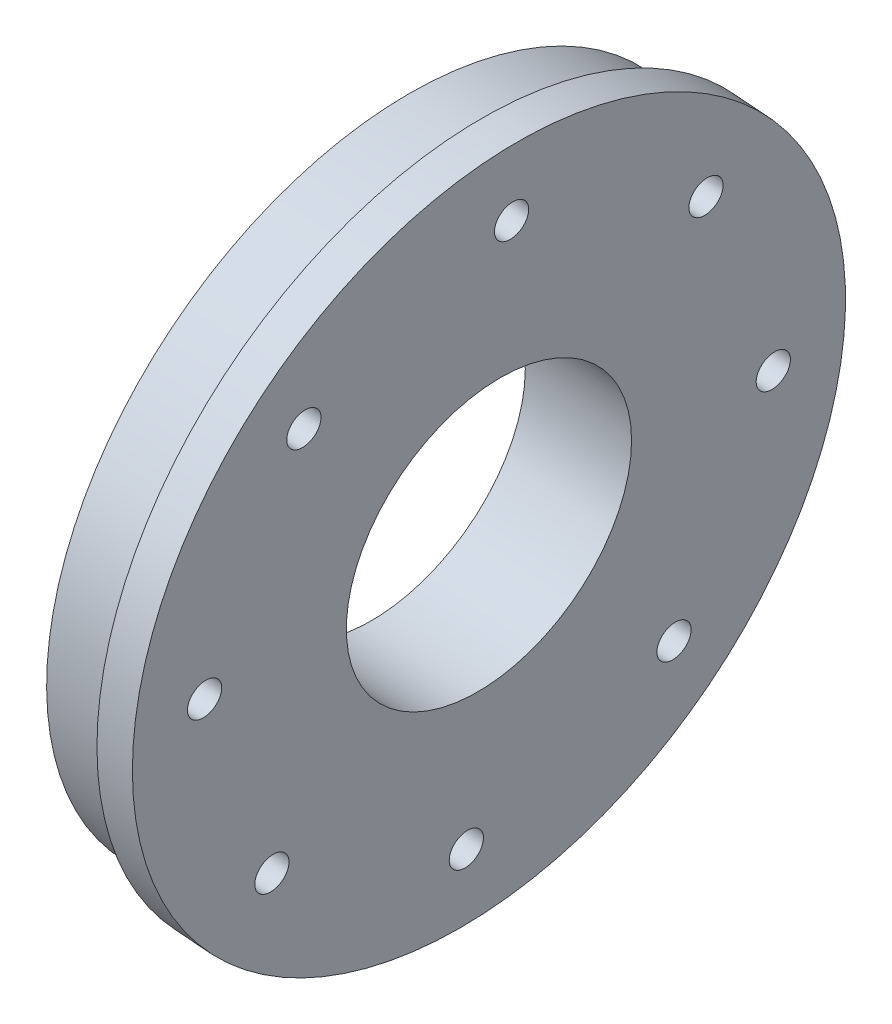
ISO-10303-21;
HEADER;
FILE_DESCRIPTION(('STEP AP214'),'2;1');
FILE_NAME('part.step','',(''),(''),'','','');
FILE_SCHEMA(('AUTOMOTIVE_DESIGN { 1 0 10303 214 1 1 1 1 }'));
ENDSEC;
DATA;
#1=APPLICATION_CONTEXT('core data for automotive mechanical design processes');
#2=APPLICATION_PROTOCOL_DEFINITION('international standard','automotive_design',2000,#1);
#3=PRODUCT_CONTEXT('',#1,'mechanical');
#4=PRODUCT('Part','Part','',(#3));
#5=PRODUCT_RELATED_PRODUCT_CATEGORY('part','',(#4));
#6=PRODUCT_DEFINITION_FORMATION('','',#4);
#7=PRODUCT_DEFINITION_CONTEXT('part definition',#1,'design');
#8=PRODUCT_DEFINITION('design','',#6,#7);
#9=PRODUCT_DEFINITION_SHAPE('','',#8);
#10=(LENGTH_UNIT() NAMED_UNIT(*) SI_UNIT(.MILLI.,.METRE.));
#11=(NAMED_UNIT(*) PLANE_ANGLE_UNIT() SI_UNIT($,.RADIAN.));
#12=(NAMED_UNIT(*) SI_UNIT($,.STERADIAN.) SOLID_ANGLE_UNIT());
#13=UNCERTAINTY_MEASURE_WITH_UNIT(LENGTH_MEASURE(1.E-05),#10,'distance_accuracy_value','');
#14=(GEOMETRIC_REPRESENTATION_CONTEXT(3) GLOBAL_UNCERTAINTY_ASSIGNED_CONTEXT((#13)) GLOBAL_UNIT_ASSIGNED_CONTEXT((#10,
#11,#12)) REPRESENTATION_CONTEXT('',''));
#15=CARTESIAN_POINT('',(0.,0.,0.));
#16=DIRECTION('',(0.,0.,1.));
#17=DIRECTION('',(1.,0.,0.));
#18=AXIS2_PLACEMENT_3D('',#15,#16,#17);
#19=CARTESIAN_POINT('',(230.211383275251,-9.78704603325022,43.174261814343));
#20=DIRECTION('',(0.996833274877087,-0.0795199477981641,0.));
#21=DIRECTION('',(0.0795199477981641,0.996833274877087,0.));
#22=AXIS2_PLACEMENT_3D('',#19,#20,#21);
#23=CYLINDRICAL_SURFACE('',#22,14.9606);
#24=CARTESIAN_POINT('',(233.376328922986,-10.0395218675094,43.174261814343));
#25=DIRECTION('',(-0.996833274877087,0.0795199477981641,0.));
#26=DIRECTION('',(-0.0795199477981641,-0.996833274877087,0.));
#27=AXIS2_PLACEMENT_3D('',#24,#25,#26);
#28=CIRCLE('',#27,14.9606);
#29=CARTESIAN_POINT('',(232.186662791956,-24.9527457596355,43.174261814343));
#30=VERTEX_POINT('',#29);
#31=EDGE_CURVE('E10',#30,#30,#28,.F.);
#32=ORIENTED_EDGE('',*,*,#31,.F.);
#33=EDGE_LOOP('',(#32));
#34=FACE_BOUND('',#33,.T.);
#35=CARTESIAN_POINT('',(230.211383275251,-9.78704603325022,43.174261814343));
#36=DIRECTION('',(0.996833274877087,-0.0795199477981641,0.));
#37=DIRECTION('',(0.0795199477981641,0.996833274877087,0.));
#38=AXIS2_PLACEMENT_3D('',#35,#36,#37);
#39=CIRCLE('',#38,14.9606);
#40=CARTESIAN_POINT('',(231.40104940628,5.12617785887592,43.174261814343));
#41=VERTEX_POINT('',#40);
#42=EDGE_CURVE('E37',#41,#41,#39,.T.);
#43=ORIENTED_EDGE('',*,*,#42,.T.);
#44=EDGE_LOOP('',(#43));
#45=FACE_BOUND('',#44,.T.);
#46=ADVANCED_FACE('F31',(#34,#45),#23,.T.);
#47=CARTESIAN_POINT('',(230.211383275251,-9.78704603325022,43.174261814343));
#48=DIRECTION('',(0.996833274877087,-0.0795199477981641,0.));
#49=DIRECTION('',(0.0795199477981641,0.996833274877087,0.));
#50=AXIS2_PLACEMENT_3D('',#47,#48,#49);
#51=PLANE('',#50);
#52=CARTESIAN_POINT('',(230.211383275251,-9.78704603325057,30.4742618143433));
#53=DIRECTION('',(-0.996833274877087,0.0795199477981641,0.));
#54=DIRECTION('',(-0.0795199477981641,-0.996833274877087,0.));
#55=AXIS2_PLACEMENT_3D('',#52,#53,#54);
#56=CIRCLE('',#55,0.761999999999999);
#57=CARTESIAN_POINT('',(230.150789075029,-10.5466329887069,30.4742618143433));
#58=VERTEX_POINT('',#57);
#59=EDGE_CURVE('E54',#58,#58,#56,.T.);
#60=ORIENTED_EDGE('',*,*,#59,.F.);
#61=EDGE_LOOP('',(#60));
#62=FACE_BOUND('',#61,.T.);
#63=CARTESIAN_POINT('',(230.925492773212,-0.835227914850099,34.1940056932739));
#64=DIRECTION('',(-0.996833274877087,0.0795199477981641,0.));
#65=DIRECTION('',(-0.0795199477981641,-0.996833274877087,0.));
#66=AXIS2_PLACEMENT_3D('',#63,#64,#65);
#67=CIRCLE('',#66,0.761999999999996);
#68=CARTESIAN_POINT('',(230.86489857299,-1.59481487030644,34.1940056932739));
#69=VERTEX_POINT('',#68);
#70=EDGE_CURVE('E92',#69,#69,#67,.T.);
#71=ORIENTED_EDGE('',*,*,#70,.F.);
#72=EDGE_LOOP('',(#71));
#73=FACE_BOUND('',#72,.T.);
#74=CARTESIAN_POINT('',(229.497273777289,-18.7388641516508,34.1940056932744));
#75=DIRECTION('',(-0.996833274877087,0.0795199477981641,0.));
#76=DIRECTION('',(-0.0795199477981641,-0.996833274877087,0.));
#77=AXIS2_PLACEMENT_3D('',#74,#75,#76);
#78=CIRCLE('',#77,0.761999999999996);
#79=CARTESIAN_POINT('',(229.436679577067,-19.4984511071072,34.1940056932744));
#80=VERTEX_POINT('',#79);
#81=EDGE_CURVE('E95',#80,#80,#78,.T.);
#82=ORIENTED_EDGE('',*,*,#81,.F.);
#83=EDGE_LOOP('',(#82));
#84=FACE_BOUND('',#83,.T.);
#85=CARTESIAN_POINT('',(229.201479938214,-22.4468286241892,43.1742618143437));
#86=DIRECTION('',(-0.996833274877087,0.0795199477981641,0.));
#87=DIRECTION('',(-0.0795199477981641,-0.996833274877087,0.));
#88=AXIS2_PLACEMENT_3D('',#85,#86,#87);
#89=CIRCLE('',#88,0.761999999999996);
#90=CARTESIAN_POINT('',(229.140885737992,-23.2064155796456,43.1742618143437));
#91=VERTEX_POINT('',#90);
#92=EDGE_CURVE('E83',#91,#91,#89,.T.);
#93=ORIENTED_EDGE('',*,*,#92,.F.);
#94=EDGE_LOOP('',(#93));
#95=FACE_BOUND('',#94,.T.);
#96=CARTESIAN_POINT('',(229.497273777289,-18.7388641516504,52.1545179354127));
#97=DIRECTION('',(-0.996833274877087,0.0795199477981641,0.));
#98=DIRECTION('',(-0.0795199477981641,-0.996833274877087,0.));
#99=AXIS2_PLACEMENT_3D('',#96,#97,#98);
#100=CIRCLE('',#99,0.761999999999996);
#101=CARTESIAN_POINT('',(229.436679577067,-19.4984511071067,52.1545179354127));
#102=VERTEX_POINT('',#101);
#103=EDGE_CURVE('E79',#102,#102,#100,.T.);
#104=ORIENTED_EDGE('',*,*,#103,.F.);
#105=EDGE_LOOP('',(#104));
#106=FACE_BOUND('',#105,.T.);
#107=CARTESIAN_POINT('',(230.211383275251,-9.78704603324989,55.8742618143433));
#108=DIRECTION('',(-0.996833274877087,0.0795199477981641,0.));
#109=DIRECTION('',(-0.0795199477981641,-0.996833274877087,0.));
#110=AXIS2_PLACEMENT_3D('',#107,#108,#109);
#111=CIRCLE('',#110,0.761999999999996);
#112=CARTESIAN_POINT('',(230.150789075029,-10.5466329887062,55.8742618143433));
#113=VERTEX_POINT('',#112);
#114=EDGE_CURVE('E82',#113,#113,#111,.T.);
#115=ORIENTED_EDGE('',*,*,#114,.F.);
#116=EDGE_LOOP('',(#115));
#117=FACE_BOUND('',#116,.T.);
#118=CARTESIAN_POINT('',(230.925492773213,-0.835227914849617,52.1545179354122));
#119=DIRECTION('',(-0.996833274877087,0.0795199477981641,0.));
#120=DIRECTION('',(-0.0795199477981641,-0.996833274877087,0.));
#121=AXIS2_PLACEMENT_3D('',#118,#119,#120);
#122=CIRCLE('',#121,0.761999999999996);
#123=CARTESIAN_POINT('',(230.86489857299,-1.59481487030595,52.1545179354122));
#124=VERTEX_POINT('',#123);
#125=EDGE_CURVE('E86',#124,#124,#122,.T.);
#126=ORIENTED_EDGE('',*,*,#125,.F.);
#127=EDGE_LOOP('',(#126));
#128=FACE_BOUND('',#127,.T.);
#129=CARTESIAN_POINT('',(231.221286612288,2.87273655768877,43.174261814343));
#130=DIRECTION('',(-0.996833274877087,0.0795199477981641,0.));
#131=DIRECTION('',(-0.0795199477981641,-0.996833274877087,0.));
#132=AXIS2_PLACEMENT_3D('',#129,#130,#131);
#133=CIRCLE('',#132,0.761999999999996);
#134=CARTESIAN_POINT('',(231.160692412065,2.11314960223244,43.174261814343));
#135=VERTEX_POINT('',#134);
#136=EDGE_CURVE('E89',#135,#135,#133,.T.);
#137=ORIENTED_EDGE('',*,*,#136,.F.);
#138=EDGE_LOOP('',(#137));
#139=FACE_BOUND('',#138,.T.);
#140=CARTESIAN_POINT('',(230.211383275251,-9.78704603325022,43.174261814343));
#141=DIRECTION('',(0.996833274877087,-0.0795199477981641,0.));
#142=DIRECTION('',(0.0795199477981641,0.996833274877087,0.));
#143=AXIS2_PLACEMENT_3D('',#140,#141,#142);
#144=CIRCLE('',#143,6.35);
#145=CARTESIAN_POINT('',(230.716334943769,-3.45715473778072,43.174261814343));
#146=VERTEX_POINT('',#145);
#147=EDGE_CURVE('E41',#146,#146,#144,.T.);
#148=ORIENTED_EDGE('',*,*,#147,.T.);
#149=EDGE_LOOP('',(#148));
#150=FACE_BOUND('',#149,.T.);
#151=ORIENTED_EDGE('',*,*,#42,.F.);
#152=EDGE_LOOP('',(#151));
#153=FACE_BOUND('',#152,.T.);
#154=ADVANCED_FACE('F120',(#62,#73,#84,#95,#106,#117,#128,#139,#150,#153),#51,.F.);
#155=CARTESIAN_POINT('',(234.958801746853,-10.165759784639,43.174261814343));
#156=DIRECTION('',(0.996833274877087,-0.0795199477981641,0.));
#157=DIRECTION('',(0.0795199477981641,0.996833274877087,0.));
#158=AXIS2_PLACEMENT_3D('',#155,#156,#157);
#159=PLANE('',#158);
#160=CARTESIAN_POINT('',(234.958801746853,-10.1657597846393,30.4742618143433));
#161=DIRECTION('',(0.996833274877087,-0.0795199477981641,0.));
#162=DIRECTION('',(0.0795199477981641,0.996833274877087,0.));
#163=AXIS2_PLACEMENT_3D('',#160,#161,#162);
#164=CIRCLE('',#163,0.761999999999999);
#165=CARTESIAN_POINT('',(235.019395947075,-9.40617282918298,30.4742618143433));
#166=VERTEX_POINT('',#165);
#167=EDGE_CURVE('E71',#166,#166,#164,.T.);
#168=ORIENTED_EDGE('',*,*,#167,.F.);
#169=EDGE_LOOP('',(#168));
#170=FACE_BOUND('',#169,.T.);
#171=CARTESIAN_POINT('',(235.672911244815,-1.21394166623885,34.1940056932739));
#172=DIRECTION('',(0.996833274877087,-0.0795199477981641,0.));
#173=DIRECTION('',(0.0795199477981641,0.996833274877087,0.));
#174=AXIS2_PLACEMENT_3D('',#171,#172,#173);
#175=CIRCLE('',#174,0.761999999999996);
#176=CARTESIAN_POINT('',(235.733505445037,-0.454354710782518,34.1940056932739));
#177=VERTEX_POINT('',#176);
#178=EDGE_CURVE('E69',#177,#177,#175,.T.);
#179=ORIENTED_EDGE('',*,*,#178,.F.);
#180=EDGE_LOOP('',(#179));
#181=FACE_BOUND('',#180,.T.);
#182=CARTESIAN_POINT('',(234.244692248891,-19.1175779030396,34.1940056932744));
#183=DIRECTION('',(0.996833274877087,-0.0795199477981641,0.));
#184=DIRECTION('',(0.0795199477981641,0.996833274877087,0.));
#185=AXIS2_PLACEMENT_3D('',#182,#183,#184);
#186=CIRCLE('',#185,0.761999999999996);
#187=CARTESIAN_POINT('',(234.305286449114,-18.3579909475832,34.1940056932744));
#188=VERTEX_POINT('',#187);
#189=EDGE_CURVE('E66',#188,#188,#186,.T.);
#190=ORIENTED_EDGE('',*,*,#189,.F.);
#191=EDGE_LOOP('',(#190));
#192=FACE_BOUND('',#191,.T.);
#193=CARTESIAN_POINT('',(233.948898409816,-22.825542375578,43.1742618143437));
#194=DIRECTION('',(0.996833274877087,-0.0795199477981641,0.));
#195=DIRECTION('',(0.0795199477981641,0.996833274877087,0.));
#196=AXIS2_PLACEMENT_3D('',#193,#194,#195);
#197=CIRCLE('',#196,0.761999999999996);
#198=CARTESIAN_POINT('',(234.009492610039,-22.0659554201216,43.1742618143437));
#199=VERTEX_POINT('',#198);
#200=EDGE_CURVE('E63',#199,#199,#197,.T.);
#201=ORIENTED_EDGE('',*,*,#200,.F.);
#202=EDGE_LOOP('',(#201));
#203=FACE_BOUND('',#202,.T.);
#204=CARTESIAN_POINT('',(234.244692248891,-19.1175779030391,52.1545179354127));
#205=DIRECTION('',(0.996833274877087,-0.0795199477981641,0.));
#206=DIRECTION('',(0.0795199477981641,0.996833274877087,0.));
#207=AXIS2_PLACEMENT_3D('',#204,#205,#206);
#208=CIRCLE('',#207,0.761999999999996);
#209=CARTESIAN_POINT('',(234.305286449114,-18.3579909475828,52.1545179354127));
#210=VERTEX_POINT('',#209);
#211=EDGE_CURVE('E60',#210,#210,#208,.T.);
#212=ORIENTED_EDGE('',*,*,#211,.F.);
#213=EDGE_LOOP('',(#212));
#214=FACE_BOUND('',#213,.T.);
#215=CARTESIAN_POINT('',(234.958801746853,-10.1657597846386,55.8742618143433));
#216=DIRECTION('',(0.996833274877087,-0.0795199477981641,0.));
#217=DIRECTION('',(0.0795199477981641,0.996833274877087,0.));
#218=AXIS2_PLACEMENT_3D('',#215,#216,#217);
#219=CIRCLE('',#218,0.761999999999996);
#220=CARTESIAN_POINT('',(235.019395947075,-9.4061728291823,55.8742618143433));
#221=VERTEX_POINT('',#220);
#222=EDGE_CURVE('E57',#221,#221,#219,.T.);
#223=ORIENTED_EDGE('',*,*,#222,.F.);
#224=EDGE_LOOP('',(#223));
#225=FACE_BOUND('',#224,.T.);
#226=CARTESIAN_POINT('',(235.672911244815,-1.21394166623837,52.1545179354122));
#227=DIRECTION('',(0.996833274877087,-0.0795199477981641,0.));
#228=DIRECTION('',(0.0795199477981641,0.996833274877087,0.));
#229=AXIS2_PLACEMENT_3D('',#226,#227,#228);
#230=CIRCLE('',#229,0.761999999999996);
#231=CARTESIAN_POINT('',(235.733505445037,-0.454354710782031,52.1545179354122));
#232=VERTEX_POINT('',#231);
#233=EDGE_CURVE('E53',#232,#232,#230,.T.);
#234=ORIENTED_EDGE('',*,*,#233,.F.);
#235=EDGE_LOOP('',(#234));
#236=FACE_BOUND('',#235,.T.);
#237=CARTESIAN_POINT('',(235.96870508389,2.49402280630003,43.174261814343));
#238=DIRECTION('',(0.996833274877087,-0.0795199477981641,0.));
#239=DIRECTION('',(0.0795199477981641,0.996833274877087,0.));
#240=AXIS2_PLACEMENT_3D('',#237,#238,#239);
#241=CIRCLE('',#240,0.761999999999996);
#242=CARTESIAN_POINT('',(236.029299284112,3.25360976175636,43.174261814343));
#243=VERTEX_POINT('',#242);
#244=EDGE_CURVE('E50',#243,#243,#241,.T.);
#245=ORIENTED_EDGE('',*,*,#244,.F.);
#246=EDGE_LOOP('',(#245));
#247=FACE_BOUND('',#246,.T.);
#248=CARTESIAN_POINT('',(234.958801746853,-10.165759784639,43.174261814343));
#249=DIRECTION('',(0.996833274877087,-0.0795199477981641,0.));
#250=DIRECTION('',(0.0795199477981641,0.996833274877087,0.));
#251=AXIS2_PLACEMENT_3D('',#248,#249,#250);
#252=CIRCLE('',#251,6.35);
#253=CARTESIAN_POINT('',(235.463753415371,-3.83586848916948,43.174261814343));
#254=VERTEX_POINT('',#253);
#255=EDGE_CURVE('E46',#254,#254,#252,.T.);
#256=ORIENTED_EDGE('',*,*,#255,.F.);
#257=EDGE_LOOP('',(#256));
#258=FACE_BOUND('',#257,.T.);
#259=CARTESIAN_POINT('',(234.958801746853,-10.165759784639,43.174261814343));
#260=DIRECTION('',(-0.996833274877087,0.0795199477981641,0.));
#261=DIRECTION('',(-0.0795199477981641,-0.996833274877087,0.));
#262=AXIS2_PLACEMENT_3D('',#259,#260,#261);
#263=CIRCLE('',#262,15.875);
#264=CARTESIAN_POINT('',(233.696422575557,-25.9904880233127,43.174261814343));
#265=VERTEX_POINT('',#264);
#266=EDGE_CURVE('E103',#265,#265,#263,.T.);
#267=ORIENTED_EDGE('',*,*,#266,.F.);
#268=EDGE_LOOP('',(#267));
#269=FACE_BOUND('',#268,.T.);
#270=ADVANCED_FACE('F117',(#170,#181,#192,#203,#214,#225,#236,#247,#258,#269),#159,.T.);
#271=CARTESIAN_POINT('',(228.628910451384,-9.66080811612064,43.174261814343));
#272=DIRECTION('',(0.996833274877087,-0.0795199477981641,0.));
#273=DIRECTION('',(0.0795199477981641,0.996833274877087,0.));
#274=AXIS2_PLACEMENT_3D('',#271,#272,#273);
#275=CYLINDRICAL_SURFACE('',#274,6.35);
#276=ORIENTED_EDGE('',*,*,#255,.T.);
#277=EDGE_LOOP('',(#276));
#278=FACE_BOUND('',#277,.T.);
#279=ORIENTED_EDGE('',*,*,#147,.F.);
#280=EDGE_LOOP('',(#279));
#281=FACE_BOUND('',#280,.T.);
#282=ADVANCED_FACE('F119',(#278,#281),#275,.F.);
#283=CARTESIAN_POINT('',(241.189619361059,2.07753707970713,43.174261814343));
#284=DIRECTION('',(-0.996833274877087,0.0795199477981641,0.));
#285=DIRECTION('',(-0.0795199477981641,-0.996833274877087,0.));
#286=AXIS2_PLACEMENT_3D('',#283,#284,#285);
#287=CYLINDRICAL_SURFACE('',#286,0.761999999999996);
#288=ORIENTED_EDGE('',*,*,#244,.T.);
#289=EDGE_LOOP('',(#288));
#290=FACE_BOUND('',#289,.T.);
#291=ORIENTED_EDGE('',*,*,#136,.T.);
#292=EDGE_LOOP('',(#291));
#293=FACE_BOUND('',#292,.T.);
#294=ADVANCED_FACE('F126',(#290,#293),#287,.F.);
#295=CARTESIAN_POINT('',(240.893825521983,-1.63042739283126,52.1545179354122));
#296=DIRECTION('',(-0.996833274877087,0.0795199477981641,0.));
#297=DIRECTION('',(-0.0795199477981641,-0.996833274877087,0.));
#298=AXIS2_PLACEMENT_3D('',#295,#296,#297);
#299=CYLINDRICAL_SURFACE('',#298,0.761999999999996);
#300=ORIENTED_EDGE('',*,*,#233,.T.);
#301=EDGE_LOOP('',(#300));
#302=FACE_BOUND('',#301,.T.);
#303=ORIENTED_EDGE('',*,*,#125,.T.);
#304=EDGE_LOOP('',(#303));
#305=FACE_BOUND('',#304,.T.);
#306=ADVANCED_FACE('F153',(#302,#305),#299,.F.);
#307=CARTESIAN_POINT('',(240.179716024022,-10.5822455112315,55.8742618143433));
#308=DIRECTION('',(-0.996833274877087,0.0795199477981641,0.));
#309=DIRECTION('',(-0.0795199477981641,-0.996833274877087,0.));
#310=AXIS2_PLACEMENT_3D('',#307,#308,#309);
#311=CYLINDRICAL_SURFACE('',#310,0.761999999999996);
#312=ORIENTED_EDGE('',*,*,#222,.T.);
#313=EDGE_LOOP('',(#312));
#314=FACE_BOUND('',#313,.T.);
#315=ORIENTED_EDGE('',*,*,#114,.T.);
#316=EDGE_LOOP('',(#315));
#317=FACE_BOUND('',#316,.T.);
#318=ADVANCED_FACE('F163',(#314,#317),#311,.F.);
#319=CARTESIAN_POINT('',(239.46560652606,-19.534063629632,52.1545179354127));
#320=DIRECTION('',(-0.996833274877087,0.0795199477981641,0.));
#321=DIRECTION('',(-0.0795199477981641,-0.996833274877087,0.));
#322=AXIS2_PLACEMENT_3D('',#319,#320,#321);
#323=CYLINDRICAL_SURFACE('',#322,0.761999999999996);
#324=ORIENTED_EDGE('',*,*,#211,.T.);
#325=EDGE_LOOP('',(#324));
#326=FACE_BOUND('',#325,.T.);
#327=ORIENTED_EDGE('',*,*,#103,.T.);
#328=EDGE_LOOP('',(#327));
#329=FACE_BOUND('',#328,.T.);
#330=ADVANCED_FACE('F173',(#326,#329),#323,.F.);
#331=CARTESIAN_POINT('',(239.169812686985,-23.2420281021709,43.1742618143437));
#332=DIRECTION('',(-0.996833274877087,0.0795199477981641,0.));
#333=DIRECTION('',(-0.0795199477981641,-0.996833274877087,0.));
#334=AXIS2_PLACEMENT_3D('',#331,#332,#333);
#335=CYLINDRICAL_SURFACE('',#334,0.761999999999996);
#336=ORIENTED_EDGE('',*,*,#200,.T.);
#337=EDGE_LOOP('',(#336));
#338=FACE_BOUND('',#337,.T.);
#339=ORIENTED_EDGE('',*,*,#92,.T.);
#340=EDGE_LOOP('',(#339));
#341=FACE_BOUND('',#340,.T.);
#342=ADVANCED_FACE('F183',(#338,#341),#335,.F.);
#343=CARTESIAN_POINT('',(239.46560652606,-19.5340636296325,34.1940056932744));
#344=DIRECTION('',(-0.996833274877087,0.0795199477981641,0.));
#345=DIRECTION('',(-0.0795199477981641,-0.996833274877087,0.));
#346=AXIS2_PLACEMENT_3D('',#343,#344,#345);
#347=CYLINDRICAL_SURFACE('',#346,0.761999999999996);
#348=ORIENTED_EDGE('',*,*,#189,.T.);
#349=EDGE_LOOP('',(#348));
#350=FACE_BOUND('',#349,.T.);
#351=ORIENTED_EDGE('',*,*,#81,.T.);
#352=EDGE_LOOP('',(#351));
#353=FACE_BOUND('',#352,.T.);
#354=ADVANCED_FACE('F193',(#350,#353),#347,.F.);
#355=CARTESIAN_POINT('',(240.893825521983,-1.63042739283174,34.1940056932739));
#356=DIRECTION('',(-0.996833274877087,0.0795199477981641,0.));
#357=DIRECTION('',(-0.0795199477981641,-0.996833274877087,0.));
#358=AXIS2_PLACEMENT_3D('',#355,#356,#357);
#359=CYLINDRICAL_SURFACE('',#358,0.761999999999996);
#360=ORIENTED_EDGE('',*,*,#178,.T.);
#361=EDGE_LOOP('',(#360));
#362=FACE_BOUND('',#361,.T.);
#363=ORIENTED_EDGE('',*,*,#70,.T.);
#364=EDGE_LOOP('',(#363));
#365=FACE_BOUND('',#364,.T.);
#366=ADVANCED_FACE('F203',(#362,#365),#359,.F.);
#367=CARTESIAN_POINT('',(240.179716024022,-10.5822455112322,30.4742618143433));
#368=DIRECTION('',(-0.996833274877087,0.0795199477981641,0.));
#369=DIRECTION('',(-0.0795199477981641,-0.996833274877087,0.));
#370=AXIS2_PLACEMENT_3D('',#367,#368,#369);
#371=CYLINDRICAL_SURFACE('',#370,0.761999999999999);
#372=ORIENTED_EDGE('',*,*,#167,.T.);
#373=EDGE_LOOP('',(#372));
#374=FACE_BOUND('',#373,.T.);
#375=ORIENTED_EDGE('',*,*,#59,.T.);
#376=EDGE_LOOP('',(#375));
#377=FACE_BOUND('',#376,.T.);
#378=ADVANCED_FACE('F212',(#374,#377),#371,.F.);
#379=CARTESIAN_POINT('',(233.376328922986,-10.0395218675094,43.174261814343));
#380=DIRECTION('',(-0.996833274877087,0.0795199477981641,0.));
#381=DIRECTION('',(-0.0795199477981641,-0.996833274877087,0.));
#382=AXIS2_PLACEMENT_3D('',#379,#380,#381);
#383=PLANE('',#382);
#384=CARTESIAN_POINT('',(233.376328922986,-10.0395218675094,43.174261814343));
#385=DIRECTION('',(-0.996833274877087,0.0795199477981641,0.));
#386=DIRECTION('',(-0.0795199477981641,-0.996833274877087,0.));
#387=AXIS2_PLACEMENT_3D('',#384,#385,#386);
#388=CIRCLE('',#387,15.875);
#389=CARTESIAN_POINT('',(232.11394975169,-25.8642501061831,43.174261814343));
#390=VERTEX_POINT('',#389);
#391=EDGE_CURVE('E96',#390,#390,#388,.T.);
#392=ORIENTED_EDGE('',*,*,#391,.T.);
#393=EDGE_LOOP('',(#392));
#394=FACE_BOUND('',#393,.T.);
#395=ORIENTED_EDGE('',*,*,#31,.T.);
#396=EDGE_LOOP('',(#395));
#397=FACE_BOUND('',#396,.T.);
#398=ADVANCED_FACE('F109',(#394,#397),#383,.T.);
#399=CARTESIAN_POINT('',(233.376328922986,-10.0395218675094,43.174261814343));
#400=DIRECTION('',(0.996833274877087,-0.0795199477981641,0.));
#401=DIRECTION('',(0.0795199477981641,0.996833274877087,0.));
#402=AXIS2_PLACEMENT_3D('',#399,#400,#401);
#403=CYLINDRICAL_SURFACE('',#402,15.875);
#404=ORIENTED_EDGE('',*,*,#391,.F.);
#405=EDGE_LOOP('',(#404));
#406=FACE_BOUND('',#405,.T.);
#407=ORIENTED_EDGE('',*,*,#266,.T.);
#408=EDGE_LOOP('',(#407));
#409=FACE_BOUND('',#408,.T.);
#410=ADVANCED_FACE('F111',(#406,#409),#403,.T.);
#411=CLOSED_SHELL('',(#46,#154,#270,#282,#294,#306,#318,#330,#342,#354,#366,#378,#398,#410));
#412=MANIFOLD_SOLID_BREP('B2',#411);
#413=ADVANCED_BREP_SHAPE_REPRESENTATION('',(#18,#412),#14);
#414=SHAPE_DEFINITION_REPRESENTATION(#9,#413);
ENDSEC;
END-ISO-10303-21;
